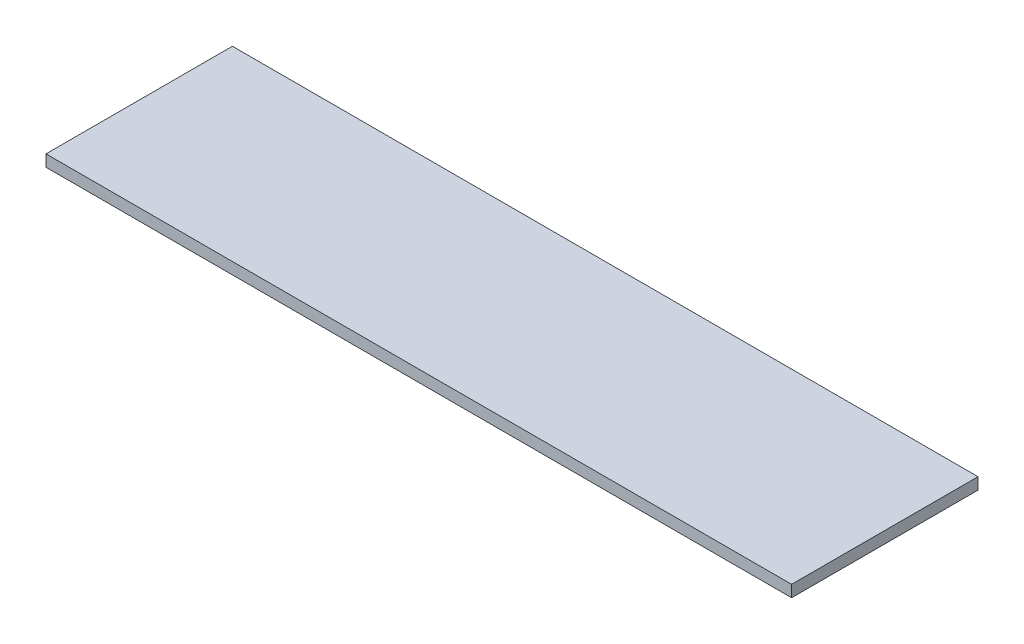
ISO-10303-21;
HEADER;
FILE_DESCRIPTION(('STEP AP214'),'2;1');
FILE_NAME('part.step','',(''),(''),'','','');
FILE_SCHEMA(('AUTOMOTIVE_DESIGN { 1 0 10303 214 1 1 1 1 }'));
ENDSEC;
DATA;
#1=APPLICATION_CONTEXT('core data for automotive mechanical design processes');
#2=APPLICATION_PROTOCOL_DEFINITION('international standard','automotive_design',2000,#1);
#3=PRODUCT_CONTEXT('',#1,'mechanical');
#4=PRODUCT('Part','Part','',(#3));
#5=PRODUCT_RELATED_PRODUCT_CATEGORY('part','',(#4));
#6=PRODUCT_DEFINITION_FORMATION('','',#4);
#7=PRODUCT_DEFINITION_CONTEXT('part definition',#1,'design');
#8=PRODUCT_DEFINITION('design','',#6,#7);
#9=PRODUCT_DEFINITION_SHAPE('','',#8);
#10=(LENGTH_UNIT() NAMED_UNIT(*) SI_UNIT(.MILLI.,.METRE.));
#11=(NAMED_UNIT(*) PLANE_ANGLE_UNIT() SI_UNIT($,.RADIAN.));
#12=(NAMED_UNIT(*) SI_UNIT($,.STERADIAN.) SOLID_ANGLE_UNIT());
#13=UNCERTAINTY_MEASURE_WITH_UNIT(LENGTH_MEASURE(1.E-05),#10,'distance_accuracy_value','');
#14=(GEOMETRIC_REPRESENTATION_CONTEXT(3) GLOBAL_UNCERTAINTY_ASSIGNED_CONTEXT((#13)) GLOBAL_UNIT_ASSIGNED_CONTEXT((#10,
#11,#12)) REPRESENTATION_CONTEXT('',''));
#15=CARTESIAN_POINT('',(0.,0.,0.));
#16=DIRECTION('',(0.,0.,1.));
#17=DIRECTION('',(1.,0.,0.));
#18=AXIS2_PLACEMENT_3D('',#15,#16,#17);
#19=CARTESIAN_POINT('',(609.6,19.05,-152.4));
#20=DIRECTION('',(-1.,0.,0.));
#21=DIRECTION('',(0.,0.,1.));
#22=AXIS2_PLACEMENT_3D('',#19,#20,#21);
#23=PLANE('',#22);
#24=DIRECTION('',(0.,0.,-1.));
#25=VECTOR('',#24,1.);
#26=CARTESIAN_POINT('',(609.6,0.,-152.4));
#27=LINE('',#26,#25);
#28=CARTESIAN_POINT('',(609.6,0.,152.4));
#29=VERTEX_POINT('',#28);
#30=CARTESIAN_POINT('',(609.6,0.,-152.4));
#31=VERTEX_POINT('',#30);
#32=EDGE_CURVE('E113',#29,#31,#27,.T.);
#33=ORIENTED_EDGE('',*,*,#32,.T.);
#34=DIRECTION('',(0.,-1.,0.));
#35=VECTOR('',#34,1.);
#36=CARTESIAN_POINT('',(609.6,19.05,-152.4));
#37=LINE('',#36,#35);
#38=CARTESIAN_POINT('',(609.6,19.05,-152.4));
#39=VERTEX_POINT('',#38);
#40=EDGE_CURVE('E11',#39,#31,#37,.T.);
#41=ORIENTED_EDGE('',*,*,#40,.F.);
#42=DIRECTION('',(0.,0.,-1.));
#43=VECTOR('',#42,1.);
#44=CARTESIAN_POINT('',(609.6,19.05,-152.4));
#45=LINE('',#44,#43);
#46=CARTESIAN_POINT('',(609.6,19.05,152.4));
#47=VERTEX_POINT('',#46);
#48=EDGE_CURVE('E97',#47,#39,#45,.T.);
#49=ORIENTED_EDGE('',*,*,#48,.F.);
#50=DIRECTION('',(0.,-1.,0.));
#51=VECTOR('',#50,1.);
#52=CARTESIAN_POINT('',(609.6,19.05,152.4));
#53=LINE('',#52,#51);
#54=EDGE_CURVE('E109',#47,#29,#53,.T.);
#55=ORIENTED_EDGE('',*,*,#54,.T.);
#56=EDGE_LOOP('',(#33,#41,#49,#55));
#57=FACE_BOUND('',#56,.T.);
#58=ADVANCED_FACE('F45',(#57),#23,.F.);
#59=CARTESIAN_POINT('',(-609.6,19.05,-152.4));
#60=DIRECTION('',(0.,0.,1.));
#61=DIRECTION('',(1.,0.,0.));
#62=AXIS2_PLACEMENT_3D('',#59,#60,#61);
#63=PLANE('',#62);
#64=DIRECTION('',(-1.,0.,0.));
#65=VECTOR('',#64,1.);
#66=CARTESIAN_POINT('',(-609.6,0.,-152.4));
#67=LINE('',#66,#65);
#68=CARTESIAN_POINT('',(-609.6,0.,-152.4));
#69=VERTEX_POINT('',#68);
#70=EDGE_CURVE('E102',#31,#69,#67,.T.);
#71=ORIENTED_EDGE('',*,*,#70,.T.);
#72=DIRECTION('',(0.,-1.,0.));
#73=VECTOR('',#72,1.);
#74=CARTESIAN_POINT('',(-609.6,19.05,-152.4));
#75=LINE('',#74,#73);
#76=CARTESIAN_POINT('',(-609.6,19.05,-152.4));
#77=VERTEX_POINT('',#76);
#78=EDGE_CURVE('E54',#77,#69,#75,.T.);
#79=ORIENTED_EDGE('',*,*,#78,.F.);
#80=DIRECTION('',(-1.,0.,0.));
#81=VECTOR('',#80,1.);
#82=CARTESIAN_POINT('',(-609.6,19.05,-152.4));
#83=LINE('',#82,#81);
#84=EDGE_CURVE('E92',#39,#77,#83,.T.);
#85=ORIENTED_EDGE('',*,*,#84,.F.);
#86=ORIENTED_EDGE('',*,*,#40,.T.);
#87=EDGE_LOOP('',(#71,#79,#85,#86));
#88=FACE_BOUND('',#87,.T.);
#89=ADVANCED_FACE('F101',(#88),#63,.F.);
#90=CARTESIAN_POINT('',(-609.6,19.05,-152.4));
#91=DIRECTION('',(1.,0.,0.));
#92=DIRECTION('',(0.,0.,-1.));
#93=AXIS2_PLACEMENT_3D('',#90,#91,#92);
#94=PLANE('',#93);
#95=DIRECTION('',(0.,0.,1.));
#96=VECTOR('',#95,1.);
#97=CARTESIAN_POINT('',(-609.6,0.,-152.4));
#98=LINE('',#97,#96);
#99=CARTESIAN_POINT('',(-609.6,0.,152.4));
#100=VERTEX_POINT('',#99);
#101=EDGE_CURVE('E79',#69,#100,#98,.T.);
#102=ORIENTED_EDGE('',*,*,#101,.T.);
#103=DIRECTION('',(0.,-1.,0.));
#104=VECTOR('',#103,1.);
#105=CARTESIAN_POINT('',(-609.6,19.05,152.4));
#106=LINE('',#105,#104);
#107=CARTESIAN_POINT('',(-609.6,19.05,152.4));
#108=VERTEX_POINT('',#107);
#109=EDGE_CURVE('E104',#108,#100,#106,.T.);
#110=ORIENTED_EDGE('',*,*,#109,.F.);
#111=DIRECTION('',(0.,0.,1.));
#112=VECTOR('',#111,1.);
#113=CARTESIAN_POINT('',(-609.6,19.05,-152.4));
#114=LINE('',#113,#112);
#115=EDGE_CURVE('E95',#77,#108,#114,.T.);
#116=ORIENTED_EDGE('',*,*,#115,.F.);
#117=ORIENTED_EDGE('',*,*,#78,.T.);
#118=EDGE_LOOP('',(#102,#110,#116,#117));
#119=FACE_BOUND('',#118,.T.);
#120=ADVANCED_FACE('F105',(#119),#94,.F.);
#121=CARTESIAN_POINT('',(-609.6,19.05,152.4));
#122=DIRECTION('',(0.,0.,-1.));
#123=DIRECTION('',(-1.,0.,0.));
#124=AXIS2_PLACEMENT_3D('',#121,#122,#123);
#125=PLANE('',#124);
#126=DIRECTION('',(1.,0.,0.));
#127=VECTOR('',#126,1.);
#128=CARTESIAN_POINT('',(-609.6,0.,152.4));
#129=LINE('',#128,#127);
#130=EDGE_CURVE('E85',#100,#29,#129,.T.);
#131=ORIENTED_EDGE('',*,*,#130,.T.);
#132=ORIENTED_EDGE('',*,*,#54,.F.);
#133=DIRECTION('',(1.,0.,0.));
#134=VECTOR('',#133,1.);
#135=CARTESIAN_POINT('',(-609.6,19.05,152.4));
#136=LINE('',#135,#134);
#137=EDGE_CURVE('E62',#108,#47,#136,.T.);
#138=ORIENTED_EDGE('',*,*,#137,.F.);
#139=ORIENTED_EDGE('',*,*,#109,.T.);
#140=EDGE_LOOP('',(#131,#132,#138,#139));
#141=FACE_BOUND('',#140,.T.);
#142=ADVANCED_FACE('F126',(#141),#125,.F.);
#143=CARTESIAN_POINT('',(0.,19.05,0.));
#144=DIRECTION('',(0.,1.,0.));
#145=DIRECTION('',(0.,0.,1.));
#146=AXIS2_PLACEMENT_3D('',#143,#144,#145);
#147=PLANE('',#146);
#148=ORIENTED_EDGE('',*,*,#48,.T.);
#149=ORIENTED_EDGE('',*,*,#84,.T.);
#150=ORIENTED_EDGE('',*,*,#115,.T.);
#151=ORIENTED_EDGE('',*,*,#137,.T.);
#152=EDGE_LOOP('',(#148,#149,#150,#151));
#153=FACE_BOUND('',#152,.T.);
#154=ADVANCED_FACE('F93',(#153),#147,.T.);
#155=CARTESIAN_POINT('',(0.,0.,0.));
#156=DIRECTION('',(0.,1.,0.));
#157=DIRECTION('',(0.,0.,1.));
#158=AXIS2_PLACEMENT_3D('',#155,#156,#157);
#159=PLANE('',#158);
#160=ORIENTED_EDGE('',*,*,#32,.F.);
#161=ORIENTED_EDGE('',*,*,#130,.F.);
#162=ORIENTED_EDGE('',*,*,#101,.F.);
#163=ORIENTED_EDGE('',*,*,#70,.F.);
#164=EDGE_LOOP('',(#160,#161,#162,#163));
#165=FACE_BOUND('',#164,.T.);
#166=ADVANCED_FACE('F129',(#165),#159,.F.);
#167=CLOSED_SHELL('',(#58,#89,#120,#142,#154,#166));
#168=MANIFOLD_SOLID_BREP('B2',#167);
#169=ADVANCED_BREP_SHAPE_REPRESENTATION('',(#18,#168),#14);
#170=SHAPE_DEFINITION_REPRESENTATION(#9,#169);
ENDSEC;
END-ISO-10303-21;
